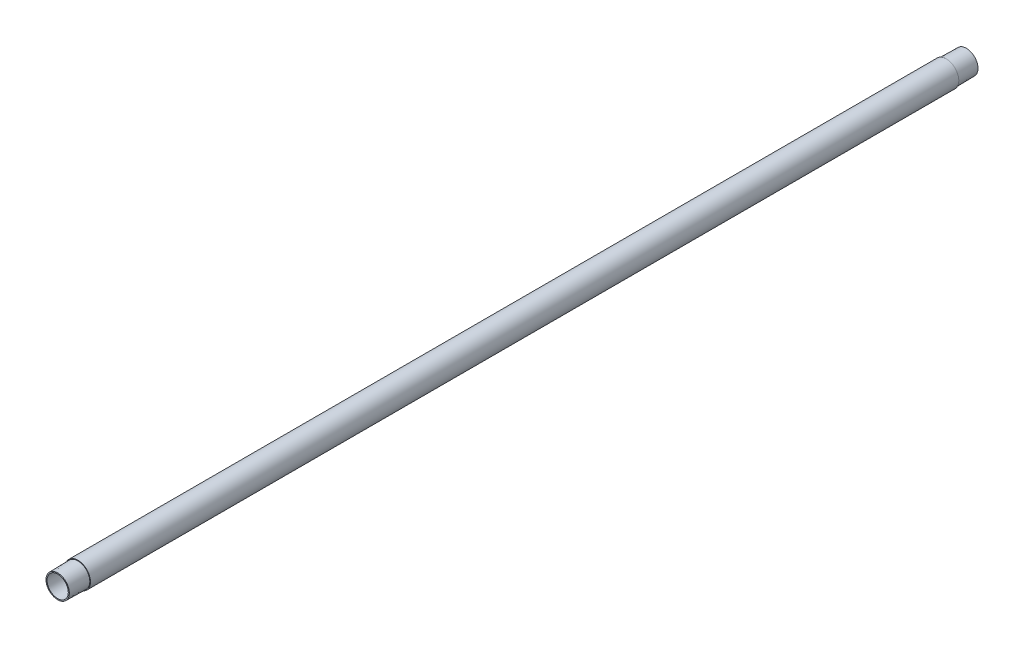
ISO-10303-21;
HEADER;
FILE_DESCRIPTION(('STEP AP214'),'2;1');
FILE_NAME('part.step','',(''),(''),'','','');
FILE_SCHEMA(('AUTOMOTIVE_DESIGN { 1 0 10303 214 1 1 1 1 }'));
ENDSEC;
DATA;
#1=APPLICATION_CONTEXT('core data for automotive mechanical design processes');
#2=APPLICATION_PROTOCOL_DEFINITION('international standard','automotive_design',2000,#1);
#3=PRODUCT_CONTEXT('',#1,'mechanical');
#4=PRODUCT('Part','Part','',(#3));
#5=PRODUCT_RELATED_PRODUCT_CATEGORY('part','',(#4));
#6=PRODUCT_DEFINITION_FORMATION('','',#4);
#7=PRODUCT_DEFINITION_CONTEXT('part definition',#1,'design');
#8=PRODUCT_DEFINITION('design','',#6,#7);
#9=PRODUCT_DEFINITION_SHAPE('','',#8);
#10=(LENGTH_UNIT() NAMED_UNIT(*) SI_UNIT(.MILLI.,.METRE.));
#11=(NAMED_UNIT(*) PLANE_ANGLE_UNIT() SI_UNIT($,.RADIAN.));
#12=(NAMED_UNIT(*) SI_UNIT($,.STERADIAN.) SOLID_ANGLE_UNIT());
#13=UNCERTAINTY_MEASURE_WITH_UNIT(LENGTH_MEASURE(1.E-05),#10,'distance_accuracy_value','');
#14=(GEOMETRIC_REPRESENTATION_CONTEXT(3) GLOBAL_UNCERTAINTY_ASSIGNED_CONTEXT((#13)) GLOBAL_UNIT_ASSIGNED_CONTEXT((#10,
#11,#12)) REPRESENTATION_CONTEXT('',''));
#15=CARTESIAN_POINT('',(0.,0.,0.));
#16=DIRECTION('',(0.,0.,1.));
#17=DIRECTION('',(1.,0.,0.));
#18=AXIS2_PLACEMENT_3D('',#15,#16,#17);
#19=CARTESIAN_POINT('',(0.,0.,457.2));
#20=DIRECTION('',(0.,0.,1.));
#21=DIRECTION('',(1.,0.,0.));
#22=AXIS2_PLACEMENT_3D('',#19,#20,#21);
#23=PLANE('',#22);
#24=CARTESIAN_POINT('',(0.,0.,457.2));
#25=DIRECTION('',(0.,0.,-1.));
#26=DIRECTION('',(-1.,0.,0.));
#27=AXIS2_PLACEMENT_3D('',#24,#25,#26);
#28=CIRCLE('',#27,5.86961321130275);
#29=CARTESIAN_POINT('',(-5.86961321130275,0.,457.2));
#30=VERTEX_POINT('',#29);
#31=EDGE_CURVE('E46',#30,#30,#28,.T.);
#32=ORIENTED_EDGE('',*,*,#31,.F.);
#33=EDGE_LOOP('',(#32));
#34=FACE_BOUND('',#33,.T.);
#35=CARTESIAN_POINT('',(0.,0.,457.2));
#36=DIRECTION('',(0.,0.,1.));
#37=DIRECTION('',(1.,0.,0.));
#38=AXIS2_PLACEMENT_3D('',#35,#36,#37);
#39=CIRCLE('',#38,5.334);
#40=CARTESIAN_POINT('',(5.334,0.,457.2));
#41=VERTEX_POINT('',#40);
#42=EDGE_CURVE('E10',#41,#41,#39,.T.);
#43=ORIENTED_EDGE('',*,*,#42,.F.);
#44=EDGE_LOOP('',(#43));
#45=FACE_BOUND('',#44,.T.);
#46=ADVANCED_FACE('F30',(#34,#45),#23,.T.);
#47=CARTESIAN_POINT('',(0.,0.,0.));
#48=DIRECTION('',(0.,0.,1.));
#49=DIRECTION('',(1.,0.,0.));
#50=AXIS2_PLACEMENT_3D('',#47,#48,#49);
#51=PLANE('',#50);
#52=CARTESIAN_POINT('',(0.,0.,0.));
#53=DIRECTION('',(0.,0.,-1.));
#54=DIRECTION('',(-1.,0.,0.));
#55=AXIS2_PLACEMENT_3D('',#52,#53,#54);
#56=CIRCLE('',#55,5.86961321130275);
#57=CARTESIAN_POINT('',(-5.86961321130275,0.,0.));
#58=VERTEX_POINT('',#57);
#59=EDGE_CURVE('E59',#58,#58,#56,.T.);
#60=ORIENTED_EDGE('',*,*,#59,.T.);
#61=EDGE_LOOP('',(#60));
#62=FACE_BOUND('',#61,.T.);
#63=CARTESIAN_POINT('',(0.,0.,0.));
#64=DIRECTION('',(0.,0.,1.));
#65=DIRECTION('',(1.,0.,0.));
#66=AXIS2_PLACEMENT_3D('',#63,#64,#65);
#67=CIRCLE('',#66,5.334);
#68=CARTESIAN_POINT('',(5.334,0.,0.));
#69=VERTEX_POINT('',#68);
#70=EDGE_CURVE('E38',#69,#69,#67,.T.);
#71=ORIENTED_EDGE('',*,*,#70,.T.);
#72=EDGE_LOOP('',(#71));
#73=FACE_BOUND('',#72,.T.);
#74=ADVANCED_FACE('F78',(#62,#73),#51,.F.);
#75=CARTESIAN_POINT('',(0.,0.,457.2));
#76=DIRECTION('',(0.,0.,-1.));
#77=DIRECTION('',(-1.,0.,0.));
#78=AXIS2_PLACEMENT_3D('',#75,#76,#77);
#79=CYLINDRICAL_SURFACE('',#78,6.35);
#80=CARTESIAN_POINT('',(0.,0.,10.1494158076318));
#81=DIRECTION('',(0.,0.,1.));
#82=DIRECTION('',(1.,0.,0.));
#83=AXIS2_PLACEMENT_3D('',#80,#81,#82);
#84=CIRCLE('',#83,6.35);
#85=CARTESIAN_POINT('',(6.35,0.,10.1494158076318));
#86=VERTEX_POINT('',#85);
#87=EDGE_CURVE('E34',#86,#86,#84,.T.);
#88=ORIENTED_EDGE('',*,*,#87,.T.);
#89=EDGE_LOOP('',(#88));
#90=FACE_BOUND('',#89,.T.);
#91=CARTESIAN_POINT('',(0.,0.,447.050584192368));
#92=DIRECTION('',(0.,0.,-1.));
#93=DIRECTION('',(-1.,0.,0.));
#94=AXIS2_PLACEMENT_3D('',#91,#92,#93);
#95=CIRCLE('',#94,6.35);
#96=CARTESIAN_POINT('',(-6.35,0.,447.050584192368));
#97=VERTEX_POINT('',#96);
#98=EDGE_CURVE('E43',#97,#97,#95,.T.);
#99=ORIENTED_EDGE('',*,*,#98,.T.);
#100=EDGE_LOOP('',(#99));
#101=FACE_BOUND('',#100,.T.);
#102=ADVANCED_FACE('F32',(#90,#101),#79,.T.);
#103=CARTESIAN_POINT('',(0.,0.,457.2));
#104=DIRECTION('',(0.,0.,-1.));
#105=DIRECTION('',(-1.,0.,0.));
#106=AXIS2_PLACEMENT_3D('',#103,#104,#105);
#107=CYLINDRICAL_SURFACE('',#106,5.334);
#108=ORIENTED_EDGE('',*,*,#42,.T.);
#109=EDGE_LOOP('',(#108));
#110=FACE_BOUND('',#109,.T.);
#111=ORIENTED_EDGE('',*,*,#70,.F.);
#112=EDGE_LOOP('',(#111));
#113=FACE_BOUND('',#112,.T.);
#114=ADVANCED_FACE('F77',(#110,#113),#107,.F.);
#115=CARTESIAN_POINT('',(0.,6.02022308683559,447.050584192368));
#116=DIRECTION('',(0.,0.,-1.));
#117=DIRECTION('',(-1.,0.,0.));
#118=AXIS2_PLACEMENT_3D('',#115,#116,#117);
#119=PLANE('',#118);
#120=CARTESIAN_POINT('',(0.,0.,447.050584192368));
#121=DIRECTION('',(0.,0.,-1.));
#122=DIRECTION('',(-1.,0.,0.));
#123=AXIS2_PLACEMENT_3D('',#120,#121,#122);
#124=CIRCLE('',#123,6.02022308683559);
#125=CARTESIAN_POINT('',(-6.02022308683559,0.,447.050584192368));
#126=VERTEX_POINT('',#125);
#127=EDGE_CURVE('E52',#126,#126,#124,.T.);
#128=ORIENTED_EDGE('',*,*,#127,.T.);
#129=EDGE_LOOP('',(#128));
#130=FACE_BOUND('',#129,.T.);
#131=ORIENTED_EDGE('',*,*,#98,.F.);
#132=EDGE_LOOP('',(#131));
#133=FACE_BOUND('',#132,.T.);
#134=ADVANCED_FACE('F84',(#130,#133),#119,.F.);
#135=CARTESIAN_POINT('',(0.,0.,457.2));
#136=DIRECTION('',(0.,0.,-1.));
#137=DIRECTION('',(-1.,0.,0.));
#138=AXIS2_PLACEMENT_3D('',#135,#136,#137);
#139=CONICAL_SURFACE('',#138,5.86961321130275,0.0148381763928078);
#140=ORIENTED_EDGE('',*,*,#127,.F.);
#141=EDGE_LOOP('',(#140));
#142=FACE_BOUND('',#141,.T.);
#143=ORIENTED_EDGE('',*,*,#31,.T.);
#144=EDGE_LOOP('',(#143));
#145=FACE_BOUND('',#144,.T.);
#146=ADVANCED_FACE('F72',(#142,#145),#139,.T.);
#147=CARTESIAN_POINT('',(0.,6.02022308683559,10.1494158076318));
#148=DIRECTION('',(0.,0.,1.));
#149=DIRECTION('',(1.,0.,0.));
#150=AXIS2_PLACEMENT_3D('',#147,#148,#149);
#151=PLANE('',#150);
#152=CARTESIAN_POINT('',(0.,0.,10.1494158076318));
#153=DIRECTION('',(0.,0.,-1.));
#154=DIRECTION('',(-1.,0.,0.));
#155=AXIS2_PLACEMENT_3D('',#152,#153,#154);
#156=CIRCLE('',#155,6.02022308683559);
#157=CARTESIAN_POINT('',(-6.02022308683559,0.,10.1494158076318));
#158=VERTEX_POINT('',#157);
#159=EDGE_CURVE('E63',#158,#158,#156,.T.);
#160=ORIENTED_EDGE('',*,*,#159,.F.);
#161=EDGE_LOOP('',(#160));
#162=FACE_BOUND('',#161,.T.);
#163=ORIENTED_EDGE('',*,*,#87,.F.);
#164=EDGE_LOOP('',(#163));
#165=FACE_BOUND('',#164,.T.);
#166=ADVANCED_FACE('F69',(#162,#165),#151,.F.);
#167=CARTESIAN_POINT('',(0.,0.,10.1494158076318));
#168=DIRECTION('',(0.,0.,1.));
#169=DIRECTION('',(1.,0.,0.));
#170=AXIS2_PLACEMENT_3D('',#167,#168,#169);
#171=CONICAL_SURFACE('',#170,6.02022308683559,0.0148381763928078);
#172=ORIENTED_EDGE('',*,*,#59,.F.);
#173=EDGE_LOOP('',(#172));
#174=FACE_BOUND('',#173,.T.);
#175=ORIENTED_EDGE('',*,*,#159,.T.);
#176=EDGE_LOOP('',(#175));
#177=FACE_BOUND('',#176,.T.);
#178=ADVANCED_FACE('F67',(#174,#177),#171,.T.);
#179=CLOSED_SHELL('',(#46,#74,#102,#114,#134,#146,#166,#178));
#180=MANIFOLD_SOLID_BREP('B2',#179);
#181=ADVANCED_BREP_SHAPE_REPRESENTATION('',(#18,#180),#14);
#182=SHAPE_DEFINITION_REPRESENTATION(#9,#181);
ENDSEC;
END-ISO-10303-21;
